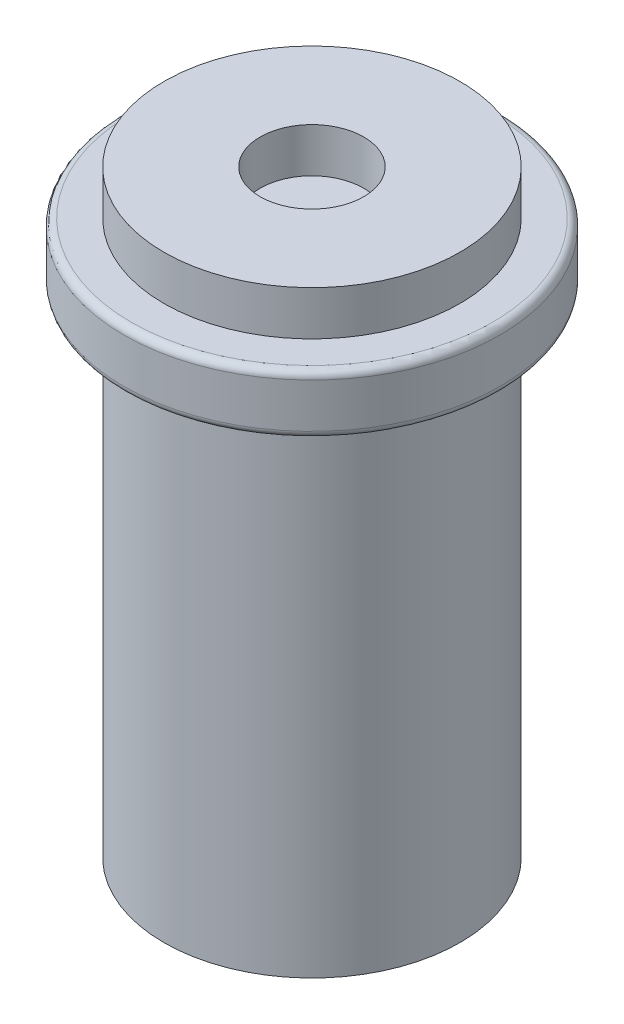
ISO-10303-21;
HEADER;
FILE_DESCRIPTION(('STEP AP214'),'2;1');
FILE_NAME('part.step','',(''),(''),'','','');
FILE_SCHEMA(('AUTOMOTIVE_DESIGN { 1 0 10303 214 1 1 1 1 }'));
ENDSEC;
DATA;
#1=APPLICATION_CONTEXT('core data for automotive mechanical design processes');
#2=APPLICATION_PROTOCOL_DEFINITION('international standard','automotive_design',2000,#1);
#3=PRODUCT_CONTEXT('',#1,'mechanical');
#4=PRODUCT('Part','Part','',(#3));
#5=PRODUCT_RELATED_PRODUCT_CATEGORY('part','',(#4));
#6=PRODUCT_DEFINITION_FORMATION('','',#4);
#7=PRODUCT_DEFINITION_CONTEXT('part definition',#1,'design');
#8=PRODUCT_DEFINITION('design','',#6,#7);
#9=PRODUCT_DEFINITION_SHAPE('','',#8);
#10=(LENGTH_UNIT() NAMED_UNIT(*) SI_UNIT(.MILLI.,.METRE.));
#11=(NAMED_UNIT(*) PLANE_ANGLE_UNIT() SI_UNIT($,.RADIAN.));
#12=(NAMED_UNIT(*) SI_UNIT($,.STERADIAN.) SOLID_ANGLE_UNIT());
#13=UNCERTAINTY_MEASURE_WITH_UNIT(LENGTH_MEASURE(1.E-05),#10,'distance_accuracy_value','');
#14=(GEOMETRIC_REPRESENTATION_CONTEXT(3) GLOBAL_UNCERTAINTY_ASSIGNED_CONTEXT((#13)) GLOBAL_UNIT_ASSIGNED_CONTEXT((#10,
#11,#12)) REPRESENTATION_CONTEXT('',''));
#15=CARTESIAN_POINT('',(0.,0.,0.));
#16=DIRECTION('',(0.,0.,1.));
#17=DIRECTION('',(1.,0.,0.));
#18=AXIS2_PLACEMENT_3D('',#15,#16,#17);
#19=CARTESIAN_POINT('',(0.,55.4,0.));
#20=DIRECTION('',(0.,-1.,0.));
#21=DIRECTION('',(0.,0.,-1.));
#22=AXIS2_PLACEMENT_3D('',#19,#20,#21);
#23=CYLINDRICAL_SURFACE('',#22,10.);
#24=CARTESIAN_POINT('',(0.,15.,0.));
#25=DIRECTION('',(0.,1.,0.));
#26=DIRECTION('',(0.,0.,1.));
#27=AXIS2_PLACEMENT_3D('',#24,#25,#26);
#28=CIRCLE('',#27,10.);
#29=CARTESIAN_POINT('',(0.,15.,10.));
#30=VERTEX_POINT('',#29);
#31=EDGE_CURVE('E60',#30,#30,#28,.T.);
#32=ORIENTED_EDGE('',*,*,#31,.T.);
#33=EDGE_LOOP('',(#32));
#34=FACE_BOUND('',#33,.T.);
#35=CARTESIAN_POINT('',(0.,48.4,0.));
#36=DIRECTION('',(0.,1.,0.));
#37=DIRECTION('',(0.,0.,1.));
#38=AXIS2_PLACEMENT_3D('',#35,#36,#37);
#39=CIRCLE('',#38,10.);
#40=CARTESIAN_POINT('',(0.,48.4,10.));
#41=VERTEX_POINT('',#40);
#42=EDGE_CURVE('E51',#41,#41,#39,.T.);
#43=ORIENTED_EDGE('',*,*,#42,.F.);
#44=EDGE_LOOP('',(#43));
#45=FACE_BOUND('',#44,.T.);
#46=ADVANCED_FACE('F30',(#34,#45),#23,.T.);
#47=CARTESIAN_POINT('',(0.,15.,0.));
#48=DIRECTION('',(0.,1.,0.));
#49=DIRECTION('',(0.,0.,1.));
#50=AXIS2_PLACEMENT_3D('',#47,#48,#49);
#51=PLANE('',#50);
#52=ORIENTED_EDGE('',*,*,#31,.F.);
#53=EDGE_LOOP('',(#52));
#54=FACE_BOUND('',#53,.T.);
#55=ADVANCED_FACE('F91',(#54),#51,.F.);
#56=CARTESIAN_POINT('',(0.,48.4,0.));
#57=DIRECTION('',(0.,1.,0.));
#58=DIRECTION('',(0.,0.,1.));
#59=AXIS2_PLACEMENT_3D('',#56,#57,#58);
#60=PLANE('',#59);
#61=CARTESIAN_POINT('',(0.,48.4,0.));
#62=DIRECTION('',(0.,1.,0.));
#63=DIRECTION('',(0.,0.,1.));
#64=AXIS2_PLACEMENT_3D('',#61,#62,#63);
#65=CIRCLE('',#64,12.2);
#66=CARTESIAN_POINT('',(0.,48.4,12.2));
#67=VERTEX_POINT('',#66);
#68=EDGE_CURVE('E38',#67,#67,#65,.F.);
#69=ORIENTED_EDGE('',*,*,#68,.T.);
#70=EDGE_LOOP('',(#69));
#71=FACE_BOUND('',#70,.T.);
#72=ORIENTED_EDGE('',*,*,#42,.T.);
#73=EDGE_LOOP('',(#72));
#74=FACE_BOUND('',#73,.T.);
#75=ADVANCED_FACE('F82',(#71,#74),#60,.F.);
#76=CARTESIAN_POINT('',(0.,52.4,0.));
#77=DIRECTION('',(0.,1.,0.));
#78=DIRECTION('',(0.,0.,1.));
#79=AXIS2_PLACEMENT_3D('',#76,#77,#78);
#80=PLANE('',#79);
#81=CARTESIAN_POINT('',(0.,52.4,0.));
#82=DIRECTION('',(0.,1.,0.));
#83=DIRECTION('',(0.,0.,1.));
#84=AXIS2_PLACEMENT_3D('',#81,#82,#83);
#85=CIRCLE('',#84,12.2);
#86=CARTESIAN_POINT('',(0.,52.4,12.2));
#87=VERTEX_POINT('',#86);
#88=EDGE_CURVE('E10',#87,#87,#85,.T.);
#89=ORIENTED_EDGE('',*,*,#88,.T.);
#90=EDGE_LOOP('',(#89));
#91=FACE_BOUND('',#90,.T.);
#92=CARTESIAN_POINT('',(0.,52.4,0.));
#93=DIRECTION('',(0.,1.,0.));
#94=DIRECTION('',(0.,0.,1.));
#95=AXIS2_PLACEMENT_3D('',#92,#93,#94);
#96=CIRCLE('',#95,10.);
#97=CARTESIAN_POINT('',(0.,52.4,10.));
#98=VERTEX_POINT('',#97);
#99=EDGE_CURVE('E59',#98,#98,#96,.T.);
#100=ORIENTED_EDGE('',*,*,#99,.F.);
#101=EDGE_LOOP('',(#100));
#102=FACE_BOUND('',#101,.T.);
#103=ADVANCED_FACE('F79',(#91,#102),#80,.T.);
#104=CARTESIAN_POINT('',(0.,48.4,0.));
#105=DIRECTION('',(0.,1.,0.));
#106=DIRECTION('',(0.,0.,1.));
#107=AXIS2_PLACEMENT_3D('',#104,#105,#106);
#108=CYLINDRICAL_SURFACE('',#107,12.7);
#109=CARTESIAN_POINT('',(0.,48.9,0.));
#110=DIRECTION('',(0.,1.,0.));
#111=DIRECTION('',(0.,0.,1.));
#112=AXIS2_PLACEMENT_3D('',#109,#110,#111);
#113=CIRCLE('',#112,12.7);
#114=CARTESIAN_POINT('',(0.,48.9,12.7));
#115=VERTEX_POINT('',#114);
#116=EDGE_CURVE('E42',#115,#115,#113,.T.);
#117=ORIENTED_EDGE('',*,*,#116,.T.);
#118=EDGE_LOOP('',(#117));
#119=FACE_BOUND('',#118,.T.);
#120=CARTESIAN_POINT('',(0.,51.9,0.));
#121=DIRECTION('',(0.,1.,0.));
#122=DIRECTION('',(0.,0.,1.));
#123=AXIS2_PLACEMENT_3D('',#120,#121,#122);
#124=CIRCLE('',#123,12.7);
#125=CARTESIAN_POINT('',(0.,51.9,12.7));
#126=VERTEX_POINT('',#125);
#127=EDGE_CURVE('E46',#126,#126,#124,.F.);
#128=ORIENTED_EDGE('',*,*,#127,.T.);
#129=EDGE_LOOP('',(#128));
#130=FACE_BOUND('',#129,.T.);
#131=ADVANCED_FACE('F81',(#119,#130),#108,.T.);
#132=ORIENTED_EDGE('',*,*,#99,.T.);
#133=EDGE_LOOP('',(#132));
#134=FACE_BOUND('',#133,.T.);
#135=CARTESIAN_POINT('',(0.,55.4,0.));
#136=DIRECTION('',(0.,1.,0.));
#137=DIRECTION('',(0.,0.,1.));
#138=AXIS2_PLACEMENT_3D('',#135,#136,#137);
#139=CIRCLE('',#138,10.);
#140=CARTESIAN_POINT('',(0.,55.4,10.));
#141=VERTEX_POINT('',#140);
#142=EDGE_CURVE('E55',#141,#141,#139,.T.);
#143=ORIENTED_EDGE('',*,*,#142,.F.);
#144=EDGE_LOOP('',(#143));
#145=FACE_BOUND('',#144,.T.);
#146=ADVANCED_FACE('F76',(#134,#145),#23,.T.);
#147=CARTESIAN_POINT('',(0.,55.4,0.));
#148=DIRECTION('',(0.,1.,0.));
#149=DIRECTION('',(0.,0.,1.));
#150=AXIS2_PLACEMENT_3D('',#147,#148,#149);
#151=PLANE('',#150);
#152=CARTESIAN_POINT('',(0.,55.4,0.));
#153=DIRECTION('',(0.,1.,0.));
#154=DIRECTION('',(0.,0.,1.));
#155=AXIS2_PLACEMENT_3D('',#152,#153,#154);
#156=CIRCLE('',#155,3.5);
#157=CARTESIAN_POINT('',(0.,55.4,3.5));
#158=VERTEX_POINT('',#157);
#159=EDGE_CURVE('E66',#158,#158,#156,.T.);
#160=ORIENTED_EDGE('',*,*,#159,.F.);
#161=EDGE_LOOP('',(#160));
#162=FACE_BOUND('',#161,.T.);
#163=ORIENTED_EDGE('',*,*,#142,.T.);
#164=EDGE_LOOP('',(#163));
#165=FACE_BOUND('',#164,.T.);
#166=ADVANCED_FACE('F108',(#162,#165),#151,.T.);
#167=CARTESIAN_POINT('',(0.,21.4,0.));
#168=DIRECTION('',(0.,1.,0.));
#169=DIRECTION('',(0.,0.,1.));
#170=AXIS2_PLACEMENT_3D('',#167,#168,#169);
#171=CYLINDRICAL_SURFACE('',#170,3.5);
#172=CARTESIAN_POINT('',(0.,52.4,0.));
#173=DIRECTION('',(0.,1.,0.));
#174=DIRECTION('',(0.,0.,1.));
#175=AXIS2_PLACEMENT_3D('',#172,#173,#174);
#176=CIRCLE('',#175,3.5);
#177=CARTESIAN_POINT('',(0.,52.4,3.5));
#178=VERTEX_POINT('',#177);
#179=EDGE_CURVE('E56',#178,#178,#176,.F.);
#180=ORIENTED_EDGE('',*,*,#179,.T.);
#181=EDGE_LOOP('',(#180));
#182=FACE_BOUND('',#181,.T.);
#183=ORIENTED_EDGE('',*,*,#159,.T.);
#184=EDGE_LOOP('',(#183));
#185=FACE_BOUND('',#184,.T.);
#186=ADVANCED_FACE('F96',(#182,#185),#171,.F.);
#187=ORIENTED_EDGE('',*,*,#179,.F.);
#188=EDGE_LOOP('',(#187));
#189=FACE_BOUND('',#188,.T.);
#190=ADVANCED_FACE('F84',(#189),#80,.T.);
#191=CARTESIAN_POINT('',(0.,48.9,0.));
#192=DIRECTION('',(0.,1.,0.));
#193=DIRECTION('',(0.,0.,1.));
#194=AXIS2_PLACEMENT_3D('',#191,#192,#193);
#195=TOROIDAL_SURFACE('',#194,12.2,0.5);
#196=ORIENTED_EDGE('',*,*,#68,.F.);
#197=EDGE_LOOP('',(#196));
#198=FACE_BOUND('',#197,.T.);
#199=ORIENTED_EDGE('',*,*,#116,.F.);
#200=EDGE_LOOP('',(#199));
#201=FACE_BOUND('',#200,.T.);
#202=ADVANCED_FACE('F95',(#198,#201),#195,.T.);
#203=CARTESIAN_POINT('',(0.,51.9,0.));
#204=DIRECTION('',(0.,1.,0.));
#205=DIRECTION('',(0.,0.,1.));
#206=AXIS2_PLACEMENT_3D('',#203,#204,#205);
#207=TOROIDAL_SURFACE('',#206,12.2,0.5);
#208=ORIENTED_EDGE('',*,*,#127,.F.);
#209=EDGE_LOOP('',(#208));
#210=FACE_BOUND('',#209,.T.);
#211=ORIENTED_EDGE('',*,*,#88,.F.);
#212=EDGE_LOOP('',(#211));
#213=FACE_BOUND('',#212,.T.);
#214=ADVANCED_FACE('F32',(#210,#213),#207,.T.);
#215=CLOSED_SHELL('',(#46,#55,#75,#103,#131,#146,#166,#186,#190,#202,#214));
#216=CARTESIAN_POINT('',(0.,48.4,0.));
#217=DIRECTION('',(0.,1.,0.));
#218=DIRECTION('',(0.,0.,1.));
#219=AXIS2_PLACEMENT_3D('',#216,#217,#218);
#220=CIRCLE('',#219,3.5);
#221=CARTESIAN_POINT('',(0.,48.4,3.5));
#222=VERTEX_POINT('',#221);
#223=EDGE_CURVE('E52',#222,#222,#220,.F.);
#224=ORIENTED_EDGE('',*,*,#223,.T.);
#225=EDGE_LOOP('',(#224));
#226=FACE_BOUND('',#225,.T.);
#227=ADVANCED_FACE('F93',(#226),#60,.F.);
#228=CARTESIAN_POINT('',(0.,21.4,0.));
#229=DIRECTION('',(0.,1.,0.));
#230=DIRECTION('',(0.,0.,1.));
#231=AXIS2_PLACEMENT_3D('',#228,#229,#230);
#232=PLANE('',#231);
#233=CARTESIAN_POINT('',(0.,21.4,0.));
#234=DIRECTION('',(0.,1.,0.));
#235=DIRECTION('',(0.,0.,1.));
#236=AXIS2_PLACEMENT_3D('',#233,#234,#235);
#237=CIRCLE('',#236,3.5);
#238=CARTESIAN_POINT('',(0.,21.4,3.5));
#239=VERTEX_POINT('',#238);
#240=EDGE_CURVE('E63',#239,#239,#237,.T.);
#241=ORIENTED_EDGE('',*,*,#240,.T.);
#242=EDGE_LOOP('',(#241));
#243=FACE_BOUND('',#242,.T.);
#244=ADVANCED_FACE('F123',(#243),#232,.T.);
#245=ORIENTED_EDGE('',*,*,#240,.F.);
#246=EDGE_LOOP('',(#245));
#247=FACE_BOUND('',#246,.T.);
#248=ORIENTED_EDGE('',*,*,#223,.F.);
#249=EDGE_LOOP('',(#248));
#250=FACE_BOUND('',#249,.T.);
#251=ADVANCED_FACE('F119',(#247,#250),#171,.F.);
#252=CLOSED_SHELL('',(#227,#244,#251));
#253=ORIENTED_CLOSED_SHELL('',*,#252,.T.);
#254=BREP_WITH_VOIDS('B2',#215,(#253));
#255=ADVANCED_BREP_SHAPE_REPRESENTATION('',(#18,#254),#14);
#256=SHAPE_DEFINITION_REPRESENTATION(#9,#255);
ENDSEC;
END-ISO-10303-21;
